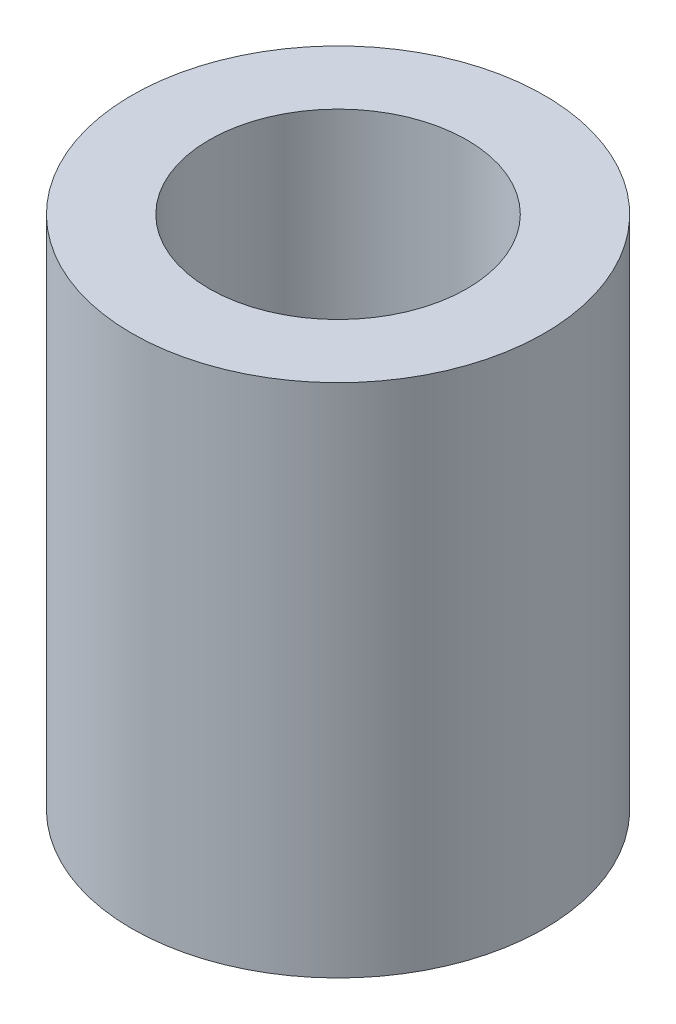
ISO-10303-21;
HEADER;
FILE_DESCRIPTION(('STEP AP214'),'2;1');
FILE_NAME('part.step','',(''),(''),'','','');
FILE_SCHEMA(('AUTOMOTIVE_DESIGN { 1 0 10303 214 1 1 1 1 }'));
ENDSEC;
DATA;
#1=APPLICATION_CONTEXT('core data for automotive mechanical design processes');
#2=APPLICATION_PROTOCOL_DEFINITION('international standard','automotive_design',2000,#1);
#3=PRODUCT_CONTEXT('',#1,'mechanical');
#4=PRODUCT('Part','Part','',(#3));
#5=PRODUCT_RELATED_PRODUCT_CATEGORY('part','',(#4));
#6=PRODUCT_DEFINITION_FORMATION('','',#4);
#7=PRODUCT_DEFINITION_CONTEXT('part definition',#1,'design');
#8=PRODUCT_DEFINITION('design','',#6,#7);
#9=PRODUCT_DEFINITION_SHAPE('','',#8);
#10=(LENGTH_UNIT() NAMED_UNIT(*) SI_UNIT(.MILLI.,.METRE.));
#11=(NAMED_UNIT(*) PLANE_ANGLE_UNIT() SI_UNIT($,.RADIAN.));
#12=(NAMED_UNIT(*) SI_UNIT($,.STERADIAN.) SOLID_ANGLE_UNIT());
#13=UNCERTAINTY_MEASURE_WITH_UNIT(LENGTH_MEASURE(1.E-05),#10,'distance_accuracy_value','');
#14=(GEOMETRIC_REPRESENTATION_CONTEXT(3) GLOBAL_UNCERTAINTY_ASSIGNED_CONTEXT((#13)) GLOBAL_UNIT_ASSIGNED_CONTEXT((#10,
#11,#12)) REPRESENTATION_CONTEXT('',''));
#15=CARTESIAN_POINT('',(0.,0.,0.));
#16=DIRECTION('',(0.,0.,1.));
#17=DIRECTION('',(1.,0.,0.));
#18=AXIS2_PLACEMENT_3D('',#15,#16,#17);
#19=CARTESIAN_POINT('',(0.,20.,0.));
#20=DIRECTION('',(0.,1.,0.));
#21=DIRECTION('',(0.,0.,1.));
#22=AXIS2_PLACEMENT_3D('',#19,#20,#21);
#23=PLANE('',#22);
#24=CARTESIAN_POINT('',(0.,20.,0.));
#25=DIRECTION('',(0.,1.,0.));
#26=DIRECTION('',(0.,0.,1.));
#27=AXIS2_PLACEMENT_3D('',#24,#25,#26);
#28=CIRCLE('',#27,8.);
#29=CARTESIAN_POINT('',(0.,20.,8.));
#30=VERTEX_POINT('',#29);
#31=EDGE_CURVE('E10',#30,#30,#28,.T.);
#32=ORIENTED_EDGE('',*,*,#31,.T.);
#33=EDGE_LOOP('',(#32));
#34=FACE_BOUND('',#33,.T.);
#35=CARTESIAN_POINT('',(0.,20.,0.));
#36=DIRECTION('',(0.,1.,0.));
#37=DIRECTION('',(0.,0.,1.));
#38=AXIS2_PLACEMENT_3D('',#35,#36,#37);
#39=CIRCLE('',#38,5.);
#40=CARTESIAN_POINT('',(0.,20.,5.));
#41=VERTEX_POINT('',#40);
#42=EDGE_CURVE('E50',#41,#41,#39,.T.);
#43=ORIENTED_EDGE('',*,*,#42,.F.);
#44=EDGE_LOOP('',(#43));
#45=FACE_BOUND('',#44,.T.);
#46=ADVANCED_FACE('F37',(#34,#45),#23,.T.);
#47=CARTESIAN_POINT('',(0.,0.,0.));
#48=DIRECTION('',(0.,1.,0.));
#49=DIRECTION('',(0.,0.,1.));
#50=AXIS2_PLACEMENT_3D('',#47,#48,#49);
#51=PLANE('',#50);
#52=CARTESIAN_POINT('',(0.,0.,0.));
#53=DIRECTION('',(0.,1.,0.));
#54=DIRECTION('',(0.,0.,1.));
#55=AXIS2_PLACEMENT_3D('',#52,#53,#54);
#56=CIRCLE('',#55,8.);
#57=CARTESIAN_POINT('',(0.,0.,8.));
#58=VERTEX_POINT('',#57);
#59=EDGE_CURVE('E41',#58,#58,#56,.T.);
#60=ORIENTED_EDGE('',*,*,#59,.F.);
#61=EDGE_LOOP('',(#60));
#62=FACE_BOUND('',#61,.T.);
#63=CARTESIAN_POINT('',(0.,0.,0.));
#64=DIRECTION('',(0.,1.,0.));
#65=DIRECTION('',(0.,0.,1.));
#66=AXIS2_PLACEMENT_3D('',#63,#64,#65);
#67=CIRCLE('',#66,5.);
#68=CARTESIAN_POINT('',(0.,0.,5.));
#69=VERTEX_POINT('',#68);
#70=EDGE_CURVE('E52',#69,#69,#67,.T.);
#71=ORIENTED_EDGE('',*,*,#70,.T.);
#72=EDGE_LOOP('',(#71));
#73=FACE_BOUND('',#72,.T.);
#74=ADVANCED_FACE('F64',(#62,#73),#51,.F.);
#75=CARTESIAN_POINT('',(0.,20.,0.));
#76=DIRECTION('',(0.,-1.,0.));
#77=DIRECTION('',(0.,0.,-1.));
#78=AXIS2_PLACEMENT_3D('',#75,#76,#77);
#79=CYLINDRICAL_SURFACE('',#78,8.);
#80=ORIENTED_EDGE('',*,*,#31,.F.);
#81=EDGE_LOOP('',(#80));
#82=FACE_BOUND('',#81,.T.);
#83=ORIENTED_EDGE('',*,*,#59,.T.);
#84=EDGE_LOOP('',(#83));
#85=FACE_BOUND('',#84,.T.);
#86=ADVANCED_FACE('F39',(#82,#85),#79,.T.);
#87=CARTESIAN_POINT('',(0.,20.,0.));
#88=DIRECTION('',(0.,-1.,0.));
#89=DIRECTION('',(0.,0.,-1.));
#90=AXIS2_PLACEMENT_3D('',#87,#88,#89);
#91=CYLINDRICAL_SURFACE('',#90,5.);
#92=ORIENTED_EDGE('',*,*,#42,.T.);
#93=EDGE_LOOP('',(#92));
#94=FACE_BOUND('',#93,.T.);
#95=ORIENTED_EDGE('',*,*,#70,.F.);
#96=EDGE_LOOP('',(#95));
#97=FACE_BOUND('',#96,.T.);
#98=ADVANCED_FACE('F60',(#94,#97),#91,.F.);
#99=CLOSED_SHELL('',(#46,#74,#86,#98));
#100=MANIFOLD_SOLID_BREP('B2',#99);
#101=ADVANCED_BREP_SHAPE_REPRESENTATION('',(#18,#100),#14);
#102=SHAPE_DEFINITION_REPRESENTATION(#9,#101);
ENDSEC;
END-ISO-10303-21;
